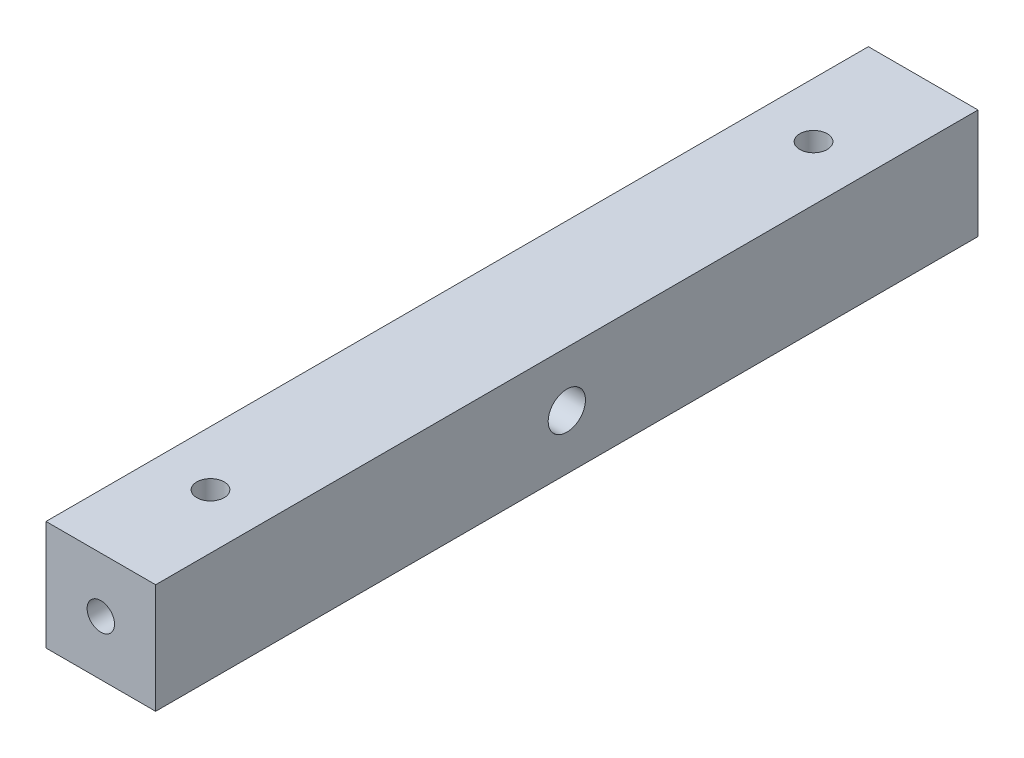
ISO-10303-21;
HEADER;
FILE_DESCRIPTION(('STEP AP214'),'2;1');
FILE_NAME('part.step','',(''),(''),'','','');
FILE_SCHEMA(('AUTOMOTIVE_DESIGN { 1 0 10303 214 1 1 1 1 }'));
ENDSEC;
DATA;
#1=APPLICATION_CONTEXT('core data for automotive mechanical design processes');
#2=APPLICATION_PROTOCOL_DEFINITION('international standard','automotive_design',2000,#1);
#3=PRODUCT_CONTEXT('',#1,'mechanical');
#4=PRODUCT('Part','Part','',(#3));
#5=PRODUCT_RELATED_PRODUCT_CATEGORY('part','',(#4));
#6=PRODUCT_DEFINITION_FORMATION('','',#4);
#7=PRODUCT_DEFINITION_CONTEXT('part definition',#1,'design');
#8=PRODUCT_DEFINITION('design','',#6,#7);
#9=PRODUCT_DEFINITION_SHAPE('','',#8);
#10=(LENGTH_UNIT() NAMED_UNIT(*) SI_UNIT(.MILLI.,.METRE.));
#11=(NAMED_UNIT(*) PLANE_ANGLE_UNIT() SI_UNIT($,.RADIAN.));
#12=(NAMED_UNIT(*) SI_UNIT($,.STERADIAN.) SOLID_ANGLE_UNIT());
#13=UNCERTAINTY_MEASURE_WITH_UNIT(LENGTH_MEASURE(1.E-05),#10,'distance_accuracy_value','');
#14=(GEOMETRIC_REPRESENTATION_CONTEXT(3) GLOBAL_UNCERTAINTY_ASSIGNED_CONTEXT((#13)) GLOBAL_UNIT_ASSIGNED_CONTEXT((#10,
#11,#12)) REPRESENTATION_CONTEXT('',''));
#15=CARTESIAN_POINT('',(0.,0.,0.));
#16=DIRECTION('',(0.,0.,1.));
#17=DIRECTION('',(1.,0.,0.));
#18=AXIS2_PLACEMENT_3D('',#15,#16,#17);
#19=CARTESIAN_POINT('',(27.5,-37.5,89.1421356237309));
#20=DIRECTION('',(1.,0.,0.));
#21=DIRECTION('',(0.,0.,-1.));
#22=AXIS2_PLACEMENT_3D('',#19,#20,#21);
#23=PLANE('',#22);
#24=CARTESIAN_POINT('',(27.5,-32.5,37.5));
#25=DIRECTION('',(-1.,0.,0.));
#26=DIRECTION('',(0.,0.,1.));
#27=AXIS2_PLACEMENT_3D('',#24,#25,#26);
#28=CIRCLE('',#27,3.15);
#29=CARTESIAN_POINT('',(27.5,-32.5,40.65));
#30=VERTEX_POINT('',#29);
#31=EDGE_CURVE('E158',#30,#30,#28,.T.);
#32=ORIENTED_EDGE('',*,*,#31,.F.);
#33=EDGE_LOOP('',(#32));
#34=FACE_BOUND('',#33,.T.);
#35=DIRECTION('',(0.,-1.,0.));
#36=VECTOR('',#35,1.);
#37=CARTESIAN_POINT('',(27.5,-37.5,75.));
#38=LINE('',#37,#36);
#39=CARTESIAN_POINT('',(27.5,-27.5,75.));
#40=VERTEX_POINT('',#39);
#41=CARTESIAN_POINT('',(27.5,-37.5,75.));
#42=VERTEX_POINT('',#41);
#43=EDGE_CURVE('E120',#40,#42,#38,.T.);
#44=ORIENTED_EDGE('',*,*,#43,.F.);
#45=DIRECTION('',(0.,0.,-1.));
#46=VECTOR('',#45,1.);
#47=CARTESIAN_POINT('',(27.5,-27.5,89.1421356237309));
#48=LINE('',#47,#46);
#49=CARTESIAN_POINT('',(27.5,-27.5,0.));
#50=VERTEX_POINT('',#49);
#51=EDGE_CURVE('E37',#40,#50,#48,.T.);
#52=ORIENTED_EDGE('',*,*,#51,.T.);
#53=DIRECTION('',(0.,-1.,0.));
#54=VECTOR('',#53,1.);
#55=CARTESIAN_POINT('',(27.5,-37.5,0.));
#56=LINE('',#55,#54);
#57=CARTESIAN_POINT('',(27.5,-37.5,0.));
#58=VERTEX_POINT('',#57);
#59=EDGE_CURVE('E116',#50,#58,#56,.T.);
#60=ORIENTED_EDGE('',*,*,#59,.T.);
#61=DIRECTION('',(0.,0.,-1.));
#62=VECTOR('',#61,1.);
#63=CARTESIAN_POINT('',(27.5,-37.5,89.1421356237309));
#64=LINE('',#63,#62);
#65=EDGE_CURVE('E72',#42,#58,#64,.T.);
#66=ORIENTED_EDGE('',*,*,#65,.F.);
#67=EDGE_LOOP('',(#44,#52,#60,#66));
#68=FACE_BOUND('',#67,.T.);
#69=ADVANCED_FACE('F33',(#34,#68),#23,.F.);
#70=CARTESIAN_POINT('',(37.5,-37.5,89.1421356237309));
#71=DIRECTION('',(0.,1.,0.));
#72=DIRECTION('',(0.,0.,1.));
#73=AXIS2_PLACEMENT_3D('',#70,#71,#72);
#74=PLANE('',#73);
#75=CARTESIAN_POINT('',(32.5,-37.5,65.));
#76=DIRECTION('',(0.,1.,0.));
#77=DIRECTION('',(0.,0.,1.));
#78=AXIS2_PLACEMENT_3D('',#75,#76,#77);
#79=CIRCLE('',#78,1.24999999999999);
#80=CARTESIAN_POINT('',(32.5,-37.5,66.25));
#81=VERTEX_POINT('',#80);
#82=EDGE_CURVE('E199',#81,#81,#79,.T.);
#83=ORIENTED_EDGE('',*,*,#82,.T.);
#84=EDGE_LOOP('',(#83));
#85=FACE_BOUND('',#84,.T.);
#86=CARTESIAN_POINT('',(32.5,-37.5,10.));
#87=DIRECTION('',(0.,1.,0.));
#88=DIRECTION('',(0.,0.,1.));
#89=AXIS2_PLACEMENT_3D('',#86,#87,#88);
#90=CIRCLE('',#89,1.24999999999999);
#91=CARTESIAN_POINT('',(32.5,-37.5,11.25));
#92=VERTEX_POINT('',#91);
#93=EDGE_CURVE('E208',#92,#92,#90,.T.);
#94=ORIENTED_EDGE('',*,*,#93,.T.);
#95=EDGE_LOOP('',(#94));
#96=FACE_BOUND('',#95,.T.);
#97=DIRECTION('',(1.,0.,0.));
#98=VECTOR('',#97,1.);
#99=CARTESIAN_POINT('',(37.5,-37.5,75.));
#100=LINE('',#99,#98);
#101=CARTESIAN_POINT('',(37.5,-37.5,75.));
#102=VERTEX_POINT('',#101);
#103=EDGE_CURVE('E42',#42,#102,#100,.T.);
#104=ORIENTED_EDGE('',*,*,#103,.F.);
#105=ORIENTED_EDGE('',*,*,#65,.T.);
#106=DIRECTION('',(1.,0.,0.));
#107=VECTOR('',#106,1.);
#108=CARTESIAN_POINT('',(37.5,-37.5,0.));
#109=LINE('',#108,#107);
#110=CARTESIAN_POINT('',(37.5,-37.5,0.));
#111=VERTEX_POINT('',#110);
#112=EDGE_CURVE('E114',#58,#111,#109,.T.);
#113=ORIENTED_EDGE('',*,*,#112,.T.);
#114=DIRECTION('',(0.,0.,-1.));
#115=VECTOR('',#114,1.);
#116=CARTESIAN_POINT('',(37.5,-37.5,89.1421356237309));
#117=LINE('',#116,#115);
#118=EDGE_CURVE('E113',#102,#111,#117,.T.);
#119=ORIENTED_EDGE('',*,*,#118,.F.);
#120=EDGE_LOOP('',(#104,#105,#113,#119));
#121=FACE_BOUND('',#120,.T.);
#122=ADVANCED_FACE('F130',(#85,#96,#121),#74,.F.);
#123=CARTESIAN_POINT('',(37.5,-37.5,89.1421356237309));
#124=DIRECTION('',(-1.,0.,0.));
#125=DIRECTION('',(0.,0.,1.));
#126=AXIS2_PLACEMENT_3D('',#123,#124,#125);
#127=PLANE('',#126);
#128=CARTESIAN_POINT('',(37.5,-32.5,37.5));
#129=DIRECTION('',(-1.,0.,0.));
#130=DIRECTION('',(0.,0.,1.));
#131=AXIS2_PLACEMENT_3D('',#128,#129,#130);
#132=CIRCLE('',#131,1.7);
#133=CARTESIAN_POINT('',(37.5,-32.5,39.2));
#134=VERTEX_POINT('',#133);
#135=EDGE_CURVE('E102',#134,#134,#132,.T.);
#136=ORIENTED_EDGE('',*,*,#135,.T.);
#137=EDGE_LOOP('',(#136));
#138=FACE_BOUND('',#137,.T.);
#139=DIRECTION('',(0.,1.,0.));
#140=VECTOR('',#139,1.);
#141=CARTESIAN_POINT('',(37.5,-37.5,75.));
#142=LINE('',#141,#140);
#143=CARTESIAN_POINT('',(37.5,-27.5,75.));
#144=VERTEX_POINT('',#143);
#145=EDGE_CURVE('E11',#102,#144,#142,.T.);
#146=ORIENTED_EDGE('',*,*,#145,.F.);
#147=ORIENTED_EDGE('',*,*,#118,.T.);
#148=DIRECTION('',(0.,1.,0.));
#149=VECTOR('',#148,1.);
#150=CARTESIAN_POINT('',(37.5,-37.5,0.));
#151=LINE('',#150,#149);
#152=CARTESIAN_POINT('',(37.5,-27.5,0.));
#153=VERTEX_POINT('',#152);
#154=EDGE_CURVE('E111',#111,#153,#151,.T.);
#155=ORIENTED_EDGE('',*,*,#154,.T.);
#156=DIRECTION('',(0.,0.,-1.));
#157=VECTOR('',#156,1.);
#158=CARTESIAN_POINT('',(37.5,-27.5,89.1421356237309));
#159=LINE('',#158,#157);
#160=EDGE_CURVE('E55',#144,#153,#159,.T.);
#161=ORIENTED_EDGE('',*,*,#160,.F.);
#162=EDGE_LOOP('',(#146,#147,#155,#161));
#163=FACE_BOUND('',#162,.T.);
#164=ADVANCED_FACE('F127',(#138,#163),#127,.F.);
#165=CARTESIAN_POINT('',(37.5,-27.5,89.1421356237309));
#166=DIRECTION('',(0.,-1.,0.));
#167=DIRECTION('',(0.,0.,-1.));
#168=AXIS2_PLACEMENT_3D('',#165,#166,#167);
#169=PLANE('',#168);
#170=CARTESIAN_POINT('',(32.5,-27.5,65.));
#171=DIRECTION('',(0.,1.,0.));
#172=DIRECTION('',(0.,0.,1.));
#173=AXIS2_PLACEMENT_3D('',#170,#171,#172);
#174=CIRCLE('',#173,1.24999999999999);
#175=CARTESIAN_POINT('',(32.5,-27.5,66.25));
#176=VERTEX_POINT('',#175);
#177=EDGE_CURVE('E201',#176,#176,#174,.T.);
#178=ORIENTED_EDGE('',*,*,#177,.F.);
#179=EDGE_LOOP('',(#178));
#180=FACE_BOUND('',#179,.T.);
#181=CARTESIAN_POINT('',(32.5,-27.5,10.));
#182=DIRECTION('',(0.,1.,0.));
#183=DIRECTION('',(0.,0.,1.));
#184=AXIS2_PLACEMENT_3D('',#181,#182,#183);
#185=CIRCLE('',#184,1.24999999999999);
#186=CARTESIAN_POINT('',(32.5,-27.5,11.25));
#187=VERTEX_POINT('',#186);
#188=EDGE_CURVE('E203',#187,#187,#185,.T.);
#189=ORIENTED_EDGE('',*,*,#188,.F.);
#190=EDGE_LOOP('',(#189));
#191=FACE_BOUND('',#190,.T.);
#192=DIRECTION('',(-1.,0.,0.));
#193=VECTOR('',#192,1.);
#194=CARTESIAN_POINT('',(37.5,-27.5,75.));
#195=LINE('',#194,#193);
#196=EDGE_CURVE('E110',#144,#40,#195,.T.);
#197=ORIENTED_EDGE('',*,*,#196,.F.);
#198=ORIENTED_EDGE('',*,*,#160,.T.);
#199=DIRECTION('',(-1.,0.,0.));
#200=VECTOR('',#199,1.);
#201=CARTESIAN_POINT('',(37.5,-27.5,0.));
#202=LINE('',#201,#200);
#203=EDGE_CURVE('E108',#153,#50,#202,.T.);
#204=ORIENTED_EDGE('',*,*,#203,.T.);
#205=ORIENTED_EDGE('',*,*,#51,.F.);
#206=EDGE_LOOP('',(#197,#198,#204,#205));
#207=FACE_BOUND('',#206,.T.);
#208=ADVANCED_FACE('F134',(#180,#191,#207),#169,.F.);
#209=CARTESIAN_POINT('',(27.5,-27.5,0.));
#210=DIRECTION('',(0.,0.,1.));
#211=DIRECTION('',(1.,0.,0.));
#212=AXIS2_PLACEMENT_3D('',#209,#210,#211);
#213=PLANE('',#212);
#214=CARTESIAN_POINT('',(32.5,-32.5,0.));
#215=DIRECTION('',(0.,0.,-1.));
#216=DIRECTION('',(-1.,0.,0.));
#217=AXIS2_PLACEMENT_3D('',#214,#215,#216);
#218=CIRCLE('',#217,1.25);
#219=CARTESIAN_POINT('',(31.25,-32.5,0.));
#220=VERTEX_POINT('',#219);
#221=EDGE_CURVE('E96',#220,#220,#218,.T.);
#222=ORIENTED_EDGE('',*,*,#221,.F.);
#223=EDGE_LOOP('',(#222));
#224=FACE_BOUND('',#223,.T.);
#225=ORIENTED_EDGE('',*,*,#59,.F.);
#226=ORIENTED_EDGE('',*,*,#203,.F.);
#227=ORIENTED_EDGE('',*,*,#154,.F.);
#228=ORIENTED_EDGE('',*,*,#112,.F.);
#229=EDGE_LOOP('',(#225,#226,#227,#228));
#230=FACE_BOUND('',#229,.T.);
#231=ADVANCED_FACE('F133',(#224,#230),#213,.F.);
#232=CARTESIAN_POINT('',(37.5,37.5,75.));
#233=DIRECTION('',(0.,0.,1.));
#234=DIRECTION('',(0.,1.,0.));
#235=AXIS2_PLACEMENT_3D('',#232,#233,#234);
#236=PLANE('',#235);
#237=CARTESIAN_POINT('',(32.5,-32.5,75.));
#238=DIRECTION('',(0.,0.,1.));
#239=DIRECTION('',(1.,0.,0.));
#240=AXIS2_PLACEMENT_3D('',#237,#238,#239);
#241=CIRCLE('',#240,1.25);
#242=CARTESIAN_POINT('',(33.75,-32.5,75.));
#243=VERTEX_POINT('',#242);
#244=EDGE_CURVE('E95',#243,#243,#241,.T.);
#245=ORIENTED_EDGE('',*,*,#244,.F.);
#246=EDGE_LOOP('',(#245));
#247=FACE_BOUND('',#246,.T.);
#248=ORIENTED_EDGE('',*,*,#196,.T.);
#249=ORIENTED_EDGE('',*,*,#43,.T.);
#250=ORIENTED_EDGE('',*,*,#103,.T.);
#251=ORIENTED_EDGE('',*,*,#145,.T.);
#252=EDGE_LOOP('',(#248,#249,#250,#251));
#253=FACE_BOUND('',#252,.T.);
#254=ADVANCED_FACE('F35',(#247,#253),#236,.T.);
#255=CARTESIAN_POINT('',(32.5,-32.5,67.5));
#256=DIRECTION('',(0.,0.,1.));
#257=DIRECTION('',(1.,0.,0.));
#258=AXIS2_PLACEMENT_3D('',#255,#256,#257);
#259=CONICAL_SURFACE('',#258,1.25,1.02974425867665);
#260=CARTESIAN_POINT('',(32.5,-32.5,66.7489242262155));
#261=VERTEX_POINT('',#260);
#262=VERTEX_LOOP('',#261);
#263=FACE_BOUND('',#262,.T.);
#264=CARTESIAN_POINT('',(32.5,-32.5,67.5));
#265=DIRECTION('',(0.,0.,1.));
#266=DIRECTION('',(1.,0.,0.));
#267=AXIS2_PLACEMENT_3D('',#264,#265,#266);
#268=CIRCLE('',#267,1.25);
#269=CARTESIAN_POINT('',(33.75,-32.5,67.5));
#270=VERTEX_POINT('',#269);
#271=EDGE_CURVE('E99',#270,#270,#268,.T.);
#272=ORIENTED_EDGE('',*,*,#271,.T.);
#273=EDGE_LOOP('',(#272));
#274=FACE_BOUND('',#273,.T.);
#275=ADVANCED_FACE('F161',(#263,#274),#259,.F.);
#276=CARTESIAN_POINT('',(32.5,-32.5,75.));
#277=DIRECTION('',(0.,0.,1.));
#278=DIRECTION('',(1.,0.,0.));
#279=AXIS2_PLACEMENT_3D('',#276,#277,#278);
#280=CYLINDRICAL_SURFACE('',#279,1.25);
#281=ORIENTED_EDGE('',*,*,#271,.F.);
#282=EDGE_LOOP('',(#281));
#283=FACE_BOUND('',#282,.T.);
#284=ORIENTED_EDGE('',*,*,#244,.T.);
#285=EDGE_LOOP('',(#284));
#286=FACE_BOUND('',#285,.T.);
#287=ADVANCED_FACE('F89',(#283,#286),#280,.F.);
#288=CARTESIAN_POINT('',(32.5,-32.5,7.5));
#289=DIRECTION('',(0.,0.,-1.));
#290=DIRECTION('',(-1.,0.,0.));
#291=AXIS2_PLACEMENT_3D('',#288,#289,#290);
#292=CONICAL_SURFACE('',#291,1.25,1.02974425867666);
#293=CARTESIAN_POINT('',(32.5,-32.5,8.25107577378445));
#294=VERTEX_POINT('',#293);
#295=VERTEX_LOOP('',#294);
#296=FACE_BOUND('',#295,.T.);
#297=CARTESIAN_POINT('',(32.5,-32.5,7.5));
#298=DIRECTION('',(0.,0.,-1.));
#299=DIRECTION('',(-1.,0.,0.));
#300=AXIS2_PLACEMENT_3D('',#297,#298,#299);
#301=CIRCLE('',#300,1.25);
#302=CARTESIAN_POINT('',(31.25,-32.5,7.5));
#303=VERTEX_POINT('',#302);
#304=EDGE_CURVE('E93',#303,#303,#301,.T.);
#305=ORIENTED_EDGE('',*,*,#304,.T.);
#306=EDGE_LOOP('',(#305));
#307=FACE_BOUND('',#306,.T.);
#308=ADVANCED_FACE('F85',(#296,#307),#292,.F.);
#309=CARTESIAN_POINT('',(32.5,-32.5,0.));
#310=DIRECTION('',(0.,0.,-1.));
#311=DIRECTION('',(-1.,0.,0.));
#312=AXIS2_PLACEMENT_3D('',#309,#310,#311);
#313=CYLINDRICAL_SURFACE('',#312,1.25);
#314=ORIENTED_EDGE('',*,*,#304,.F.);
#315=EDGE_LOOP('',(#314));
#316=FACE_BOUND('',#315,.T.);
#317=ORIENTED_EDGE('',*,*,#221,.T.);
#318=EDGE_LOOP('',(#317));
#319=FACE_BOUND('',#318,.T.);
#320=ADVANCED_FACE('F88',(#316,#319),#313,.F.);
#321=CARTESIAN_POINT('',(27.5,-32.5,37.5));
#322=DIRECTION('',(-1.,0.,0.));
#323=DIRECTION('',(0.,0.,1.));
#324=AXIS2_PLACEMENT_3D('',#321,#322,#323);
#325=CYLINDRICAL_SURFACE('',#324,1.7);
#326=ORIENTED_EDGE('',*,*,#135,.F.);
#327=EDGE_LOOP('',(#326));
#328=FACE_BOUND('',#327,.T.);
#329=CARTESIAN_POINT('',(28.95,-32.5,37.5));
#330=DIRECTION('',(-1.,0.,0.));
#331=DIRECTION('',(0.,0.,1.));
#332=AXIS2_PLACEMENT_3D('',#329,#330,#331);
#333=CIRCLE('',#332,1.7);
#334=CARTESIAN_POINT('',(28.95,-32.5,39.2));
#335=VERTEX_POINT('',#334);
#336=EDGE_CURVE('E212',#335,#335,#333,.T.);
#337=ORIENTED_EDGE('',*,*,#336,.T.);
#338=EDGE_LOOP('',(#337));
#339=FACE_BOUND('',#338,.T.);
#340=ADVANCED_FACE('F179',(#328,#339),#325,.F.);
#341=CARTESIAN_POINT('',(27.5,-32.5,37.5));
#342=DIRECTION('',(-1.,0.,0.));
#343=DIRECTION('',(0.,0.,1.));
#344=AXIS2_PLACEMENT_3D('',#341,#342,#343);
#345=CONICAL_SURFACE('',#344,3.15,0.785398163397448);
#346=ORIENTED_EDGE('',*,*,#336,.F.);
#347=EDGE_LOOP('',(#346));
#348=FACE_BOUND('',#347,.T.);
#349=ORIENTED_EDGE('',*,*,#31,.T.);
#350=EDGE_LOOP('',(#349));
#351=FACE_BOUND('',#350,.T.);
#352=ADVANCED_FACE('F182',(#348,#351),#345,.F.);
#353=CARTESIAN_POINT('',(32.5,-27.5,10.));
#354=DIRECTION('',(0.,1.,0.));
#355=DIRECTION('',(0.,0.,1.));
#356=AXIS2_PLACEMENT_3D('',#353,#354,#355);
#357=CYLINDRICAL_SURFACE('',#356,1.24999999999999);
#358=ORIENTED_EDGE('',*,*,#93,.F.);
#359=EDGE_LOOP('',(#358));
#360=FACE_BOUND('',#359,.T.);
#361=ORIENTED_EDGE('',*,*,#188,.T.);
#362=EDGE_LOOP('',(#361));
#363=FACE_BOUND('',#362,.T.);
#364=ADVANCED_FACE('F186',(#360,#363),#357,.F.);
#365=CARTESIAN_POINT('',(32.5,-27.5,65.));
#366=DIRECTION('',(0.,1.,0.));
#367=DIRECTION('',(0.,0.,1.));
#368=AXIS2_PLACEMENT_3D('',#365,#366,#367);
#369=CYLINDRICAL_SURFACE('',#368,1.24999999999999);
#370=ORIENTED_EDGE('',*,*,#82,.F.);
#371=EDGE_LOOP('',(#370));
#372=FACE_BOUND('',#371,.T.);
#373=ORIENTED_EDGE('',*,*,#177,.T.);
#374=EDGE_LOOP('',(#373));
#375=FACE_BOUND('',#374,.T.);
#376=ADVANCED_FACE('F190',(#372,#375),#369,.F.);
#377=CLOSED_SHELL('',(#69,#122,#164,#208,#231,#254,#275,#287,#308,#320,#340,#352,#364,#376));
#378=MANIFOLD_SOLID_BREP('B2',#377);
#379=ADVANCED_BREP_SHAPE_REPRESENTATION('',(#18,#378),#14);
#380=SHAPE_DEFINITION_REPRESENTATION(#9,#379);
ENDSEC;
END-ISO-10303-21;
